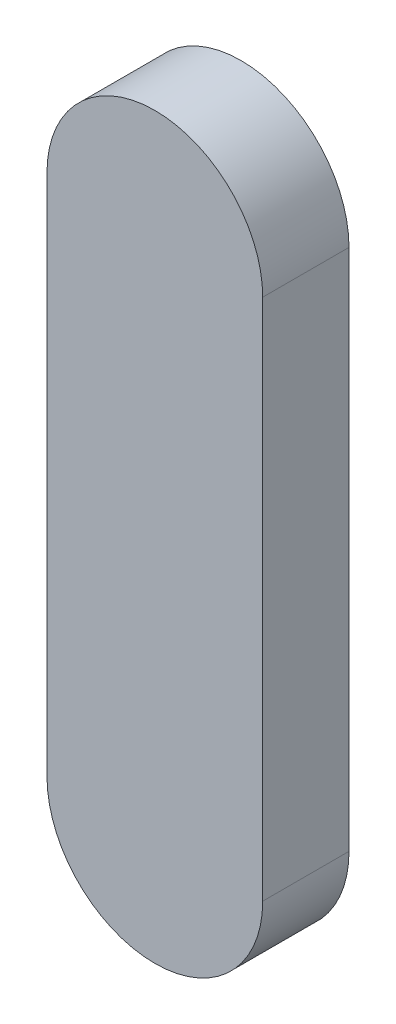
ISO-10303-21;
HEADER;
FILE_DESCRIPTION(('STEP AP214'),'2;1');
FILE_NAME('part.step','',(''),(''),'','','');
FILE_SCHEMA(('AUTOMOTIVE_DESIGN { 1 0 10303 214 1 1 1 1 }'));
ENDSEC;
DATA;
#1=APPLICATION_CONTEXT('core data for automotive mechanical design processes');
#2=APPLICATION_PROTOCOL_DEFINITION('international standard','automotive_design',2000,#1);
#3=PRODUCT_CONTEXT('',#1,'mechanical');
#4=PRODUCT('Part','Part','',(#3));
#5=PRODUCT_RELATED_PRODUCT_CATEGORY('part','',(#4));
#6=PRODUCT_DEFINITION_FORMATION('','',#4);
#7=PRODUCT_DEFINITION_CONTEXT('part definition',#1,'design');
#8=PRODUCT_DEFINITION('design','',#6,#7);
#9=PRODUCT_DEFINITION_SHAPE('','',#8);
#10=(LENGTH_UNIT() NAMED_UNIT(*) SI_UNIT(.MILLI.,.METRE.));
#11=(NAMED_UNIT(*) PLANE_ANGLE_UNIT() SI_UNIT($,.RADIAN.));
#12=(NAMED_UNIT(*) SI_UNIT($,.STERADIAN.) SOLID_ANGLE_UNIT());
#13=UNCERTAINTY_MEASURE_WITH_UNIT(LENGTH_MEASURE(1.E-05),#10,'distance_accuracy_value','');
#14=(GEOMETRIC_REPRESENTATION_CONTEXT(3) GLOBAL_UNCERTAINTY_ASSIGNED_CONTEXT((#13)) GLOBAL_UNIT_ASSIGNED_CONTEXT((#10,
#11,#12)) REPRESENTATION_CONTEXT('',''));
#15=CARTESIAN_POINT('',(0.,0.,0.));
#16=DIRECTION('',(0.,0.,1.));
#17=DIRECTION('',(1.,0.,0.));
#18=AXIS2_PLACEMENT_3D('',#15,#16,#17);
#19=CARTESIAN_POINT('',(101.530582605491,-39.4482485774262,2.54));
#20=DIRECTION('',(0.,0.,-1.));
#21=DIRECTION('',(-1.,0.,0.));
#22=AXIS2_PLACEMENT_3D('',#19,#20,#21);
#23=CYLINDRICAL_SURFACE('',#22,3.17500000000001);
#24=CARTESIAN_POINT('',(101.530582605491,-39.4482485774262,0.));
#25=DIRECTION('',(0.,0.,1.));
#26=DIRECTION('',(1.,0.,0.));
#27=AXIS2_PLACEMENT_3D('',#24,#25,#26);
#28=CIRCLE('',#27,3.17500000000001);
#29=CARTESIAN_POINT('',(98.3555826054909,-39.4482485774262,0.));
#30=VERTEX_POINT('',#29);
#31=CARTESIAN_POINT('',(104.705582605491,-39.4482485774262,0.));
#32=VERTEX_POINT('',#31);
#33=EDGE_CURVE('E95',#30,#32,#28,.T.);
#34=ORIENTED_EDGE('',*,*,#33,.T.);
#35=DIRECTION('',(0.,0.,-1.));
#36=VECTOR('',#35,1.);
#37=CARTESIAN_POINT('',(104.705582605491,-39.4482485774262,2.54));
#38=LINE('',#37,#36);
#39=CARTESIAN_POINT('',(104.705582605491,-39.4482485774262,2.54));
#40=VERTEX_POINT('',#39);
#41=EDGE_CURVE('E11',#40,#32,#38,.T.);
#42=ORIENTED_EDGE('',*,*,#41,.F.);
#43=CARTESIAN_POINT('',(101.530582605491,-39.4482485774262,2.54));
#44=DIRECTION('',(0.,0.,1.));
#45=DIRECTION('',(1.,0.,0.));
#46=AXIS2_PLACEMENT_3D('',#43,#44,#45);
#47=CIRCLE('',#46,3.17500000000001);
#48=CARTESIAN_POINT('',(98.3555826054909,-39.4482485774262,2.54));
#49=VERTEX_POINT('',#48);
#50=EDGE_CURVE('E83',#49,#40,#47,.T.);
#51=ORIENTED_EDGE('',*,*,#50,.F.);
#52=DIRECTION('',(0.,0.,-1.));
#53=VECTOR('',#52,1.);
#54=CARTESIAN_POINT('',(98.3555826054909,-39.4482485774262,2.54));
#55=LINE('',#54,#53);
#56=EDGE_CURVE('E91',#49,#30,#55,.T.);
#57=ORIENTED_EDGE('',*,*,#56,.T.);
#58=EDGE_LOOP('',(#34,#42,#51,#57));
#59=FACE_BOUND('',#58,.T.);
#60=ADVANCED_FACE('F32',(#59),#23,.T.);
#61=CARTESIAN_POINT('',(104.705582605491,-39.4482485774262,2.54));
#62=DIRECTION('',(-1.,0.,0.));
#63=DIRECTION('',(0.,-1.,0.));
#64=AXIS2_PLACEMENT_3D('',#61,#62,#63);
#65=PLANE('',#64);
#66=DIRECTION('',(0.,1.,0.));
#67=VECTOR('',#66,1.);
#68=CARTESIAN_POINT('',(104.705582605491,-39.4482485774262,0.));
#69=LINE('',#68,#67);
#70=CARTESIAN_POINT('',(104.705582605491,-24.0517514225738,0.));
#71=VERTEX_POINT('',#70);
#72=EDGE_CURVE('E87',#32,#71,#69,.T.);
#73=ORIENTED_EDGE('',*,*,#72,.T.);
#74=DIRECTION('',(0.,0.,-1.));
#75=VECTOR('',#74,1.);
#76=CARTESIAN_POINT('',(104.705582605491,-24.0517514225738,2.54));
#77=LINE('',#76,#75);
#78=CARTESIAN_POINT('',(104.705582605491,-24.0517514225738,2.54));
#79=VERTEX_POINT('',#78);
#80=EDGE_CURVE('E40',#79,#71,#77,.T.);
#81=ORIENTED_EDGE('',*,*,#80,.F.);
#82=DIRECTION('',(0.,1.,0.));
#83=VECTOR('',#82,1.);
#84=CARTESIAN_POINT('',(104.705582605491,-39.4482485774262,2.54));
#85=LINE('',#84,#83);
#86=EDGE_CURVE('E78',#40,#79,#85,.T.);
#87=ORIENTED_EDGE('',*,*,#86,.F.);
#88=ORIENTED_EDGE('',*,*,#41,.T.);
#89=EDGE_LOOP('',(#73,#81,#87,#88));
#90=FACE_BOUND('',#89,.T.);
#91=ADVANCED_FACE('F86',(#90),#65,.F.);
#92=CARTESIAN_POINT('',(101.530582605491,-24.0517514225738,2.54));
#93=DIRECTION('',(0.,0.,-1.));
#94=DIRECTION('',(-1.,0.,0.));
#95=AXIS2_PLACEMENT_3D('',#92,#93,#94);
#96=CYLINDRICAL_SURFACE('',#95,3.17500000000003);
#97=CARTESIAN_POINT('',(101.530582605491,-24.0517514225738,0.));
#98=DIRECTION('',(0.,0.,1.));
#99=DIRECTION('',(1.,0.,0.));
#100=AXIS2_PLACEMENT_3D('',#97,#98,#99);
#101=CIRCLE('',#100,3.17500000000003);
#102=CARTESIAN_POINT('',(98.3555826054909,-24.0517514225738,0.));
#103=VERTEX_POINT('',#102);
#104=EDGE_CURVE('E65',#71,#103,#101,.T.);
#105=ORIENTED_EDGE('',*,*,#104,.T.);
#106=DIRECTION('',(0.,0.,-1.));
#107=VECTOR('',#106,1.);
#108=CARTESIAN_POINT('',(98.3555826054909,-24.0517514225738,2.54));
#109=LINE('',#108,#107);
#110=CARTESIAN_POINT('',(98.3555826054909,-24.0517514225738,2.54));
#111=VERTEX_POINT('',#110);
#112=EDGE_CURVE('E88',#111,#103,#109,.T.);
#113=ORIENTED_EDGE('',*,*,#112,.F.);
#114=CARTESIAN_POINT('',(101.530582605491,-24.0517514225738,2.54));
#115=DIRECTION('',(0.,0.,1.));
#116=DIRECTION('',(1.,0.,0.));
#117=AXIS2_PLACEMENT_3D('',#114,#115,#116);
#118=CIRCLE('',#117,3.17500000000003);
#119=EDGE_CURVE('E81',#79,#111,#118,.T.);
#120=ORIENTED_EDGE('',*,*,#119,.F.);
#121=ORIENTED_EDGE('',*,*,#80,.T.);
#122=EDGE_LOOP('',(#105,#113,#120,#121));
#123=FACE_BOUND('',#122,.T.);
#124=ADVANCED_FACE('F89',(#123),#96,.T.);
#125=CARTESIAN_POINT('',(98.3555826054909,-24.0517514225738,2.54));
#126=DIRECTION('',(1.,0.,0.));
#127=DIRECTION('',(0.,0.,-1.));
#128=AXIS2_PLACEMENT_3D('',#125,#126,#127);
#129=PLANE('',#128);
#130=DIRECTION('',(0.,-1.,0.));
#131=VECTOR('',#130,1.);
#132=CARTESIAN_POINT('',(98.3555826054909,-24.0517514225738,0.));
#133=LINE('',#132,#131);
#134=EDGE_CURVE('E71',#103,#30,#133,.T.);
#135=ORIENTED_EDGE('',*,*,#134,.T.);
#136=ORIENTED_EDGE('',*,*,#56,.F.);
#137=DIRECTION('',(0.,-1.,0.));
#138=VECTOR('',#137,1.);
#139=CARTESIAN_POINT('',(98.3555826054909,-24.0517514225738,2.54));
#140=LINE('',#139,#138);
#141=EDGE_CURVE('E48',#111,#49,#140,.T.);
#142=ORIENTED_EDGE('',*,*,#141,.F.);
#143=ORIENTED_EDGE('',*,*,#112,.T.);
#144=EDGE_LOOP('',(#135,#136,#142,#143));
#145=FACE_BOUND('',#144,.T.);
#146=ADVANCED_FACE('F102',(#145),#129,.F.);
#147=CARTESIAN_POINT('',(101.530582605491,-39.4482485774262,2.54));
#148=DIRECTION('',(0.,0.,1.));
#149=DIRECTION('',(1.,0.,0.));
#150=AXIS2_PLACEMENT_3D('',#147,#148,#149);
#151=PLANE('',#150);
#152=ORIENTED_EDGE('',*,*,#50,.T.);
#153=ORIENTED_EDGE('',*,*,#86,.T.);
#154=ORIENTED_EDGE('',*,*,#119,.T.);
#155=ORIENTED_EDGE('',*,*,#141,.T.);
#156=EDGE_LOOP('',(#152,#153,#154,#155));
#157=FACE_BOUND('',#156,.T.);
#158=ADVANCED_FACE('F79',(#157),#151,.T.);
#159=CARTESIAN_POINT('',(101.530582605491,-39.4482485774262,0.));
#160=DIRECTION('',(0.,0.,1.));
#161=DIRECTION('',(1.,0.,0.));
#162=AXIS2_PLACEMENT_3D('',#159,#160,#161);
#163=PLANE('',#162);
#164=ORIENTED_EDGE('',*,*,#33,.F.);
#165=ORIENTED_EDGE('',*,*,#134,.F.);
#166=ORIENTED_EDGE('',*,*,#104,.F.);
#167=ORIENTED_EDGE('',*,*,#72,.F.);
#168=EDGE_LOOP('',(#164,#165,#166,#167));
#169=FACE_BOUND('',#168,.T.);
#170=ADVANCED_FACE('F105',(#169),#163,.F.);
#171=CLOSED_SHELL('',(#60,#91,#124,#146,#158,#170));
#172=MANIFOLD_SOLID_BREP('B2',#171);
#173=ADVANCED_BREP_SHAPE_REPRESENTATION('',(#18,#172),#14);
#174=SHAPE_DEFINITION_REPRESENTATION(#9,#173);
ENDSEC;
END-ISO-10303-21;
